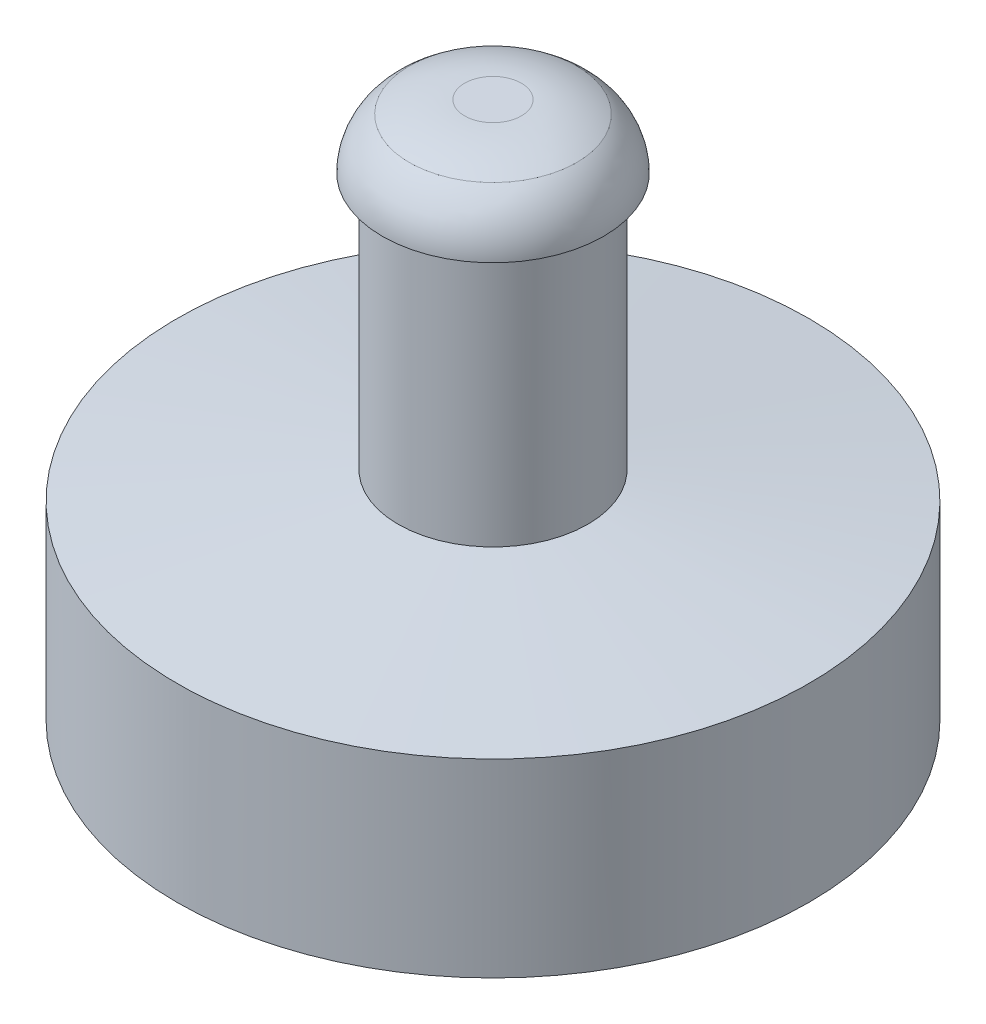
ISO-10303-21;
HEADER;
FILE_DESCRIPTION(('STEP AP214'),'2;1');
FILE_NAME('part.step','',(''),(''),'','','');
FILE_SCHEMA(('AUTOMOTIVE_DESIGN { 1 0 10303 214 1 1 1 1 }'));
ENDSEC;
DATA;
#1=APPLICATION_CONTEXT('core data for automotive mechanical design processes');
#2=APPLICATION_PROTOCOL_DEFINITION('international standard','automotive_design',2000,#1);
#3=PRODUCT_CONTEXT('',#1,'mechanical');
#4=PRODUCT('Part','Part','',(#3));
#5=PRODUCT_RELATED_PRODUCT_CATEGORY('part','',(#4));
#6=PRODUCT_DEFINITION_FORMATION('','',#4);
#7=PRODUCT_DEFINITION_CONTEXT('part definition',#1,'design');
#8=PRODUCT_DEFINITION('design','',#6,#7);
#9=PRODUCT_DEFINITION_SHAPE('','',#8);
#10=(LENGTH_UNIT() NAMED_UNIT(*) SI_UNIT(.MILLI.,.METRE.));
#11=(NAMED_UNIT(*) PLANE_ANGLE_UNIT() SI_UNIT($,.RADIAN.));
#12=(NAMED_UNIT(*) SI_UNIT($,.STERADIAN.) SOLID_ANGLE_UNIT());
#13=UNCERTAINTY_MEASURE_WITH_UNIT(LENGTH_MEASURE(1.E-05),#10,'distance_accuracy_value','');
#14=(GEOMETRIC_REPRESENTATION_CONTEXT(3) GLOBAL_UNCERTAINTY_ASSIGNED_CONTEXT((#13)) GLOBAL_UNIT_ASSIGNED_CONTEXT((#10,
#11,#12)) REPRESENTATION_CONTEXT('',''));
#15=CARTESIAN_POINT('',(0.,0.,0.));
#16=DIRECTION('',(0.,0.,1.));
#17=DIRECTION('',(1.,0.,0.));
#18=AXIS2_PLACEMENT_3D('',#15,#16,#17);
#19=CARTESIAN_POINT('',(0.,3.5,0.));
#20=DIRECTION('',(0.,-1.,0.));
#21=DIRECTION('',(0.,0.,-1.));
#22=AXIS2_PLACEMENT_3D('',#19,#20,#21);
#23=CYLINDRICAL_SURFACE('',#22,5.);
#24=CARTESIAN_POINT('',(0.,3.,0.));
#25=DIRECTION('',(0.,1.,0.));
#26=DIRECTION('',(0.,0.,1.));
#27=AXIS2_PLACEMENT_3D('',#24,#25,#26);
#28=CIRCLE('',#27,5.);
#29=CARTESIAN_POINT('',(0.,3.,-5.));
#30=VERTEX_POINT('',#29);
#31=EDGE_CURVE('E61',#30,#30,#28,.F.);
#32=ORIENTED_EDGE('',*,*,#31,.T.);
#33=EDGE_LOOP('',(#32));
#34=FACE_BOUND('',#33,.T.);
#35=CARTESIAN_POINT('',(0.,0.,0.));
#36=DIRECTION('',(0.,1.,0.));
#37=DIRECTION('',(0.,0.,1.));
#38=AXIS2_PLACEMENT_3D('',#35,#36,#37);
#39=CIRCLE('',#38,5.);
#40=CARTESIAN_POINT('',(0.,0.,5.));
#41=VERTEX_POINT('',#40);
#42=EDGE_CURVE('E67',#41,#41,#39,.T.);
#43=ORIENTED_EDGE('',*,*,#42,.T.);
#44=EDGE_LOOP('',(#43));
#45=FACE_BOUND('',#44,.T.);
#46=ADVANCED_FACE('F43',(#34,#45),#23,.T.);
#47=CARTESIAN_POINT('',(0.,0.,0.));
#48=DIRECTION('',(0.,1.,0.));
#49=DIRECTION('',(0.,0.,1.));
#50=AXIS2_PLACEMENT_3D('',#47,#48,#49);
#51=PLANE('',#50);
#52=ORIENTED_EDGE('',*,*,#42,.F.);
#53=EDGE_LOOP('',(#52));
#54=FACE_BOUND('',#53,.T.);
#55=ADVANCED_FACE('F96',(#54),#51,.F.);
#56=CARTESIAN_POINT('',(0.,3.5,0.));
#57=DIRECTION('',(0.,-1.,0.));
#58=DIRECTION('',(0.,0.,-1.));
#59=AXIS2_PLACEMENT_3D('',#56,#57,#58);
#60=CONICAL_SURFACE('',#59,0.927826786012709,1.44862327915529);
#61=CARTESIAN_POINT('',(0.,3.42974596316017,0.));
#62=DIRECTION('',(0.,-1.,0.));
#63=DIRECTION('',(0.,0.,-1.));
#64=AXIS2_PLACEMENT_3D('',#61,#62,#63);
#65=CIRCLE('',#64,1.5);
#66=CARTESIAN_POINT('',(0.,3.42974596316017,-1.5));
#67=VERTEX_POINT('',#66);
#68=EDGE_CURVE('E56',#67,#67,#65,.F.);
#69=CARTESIAN_POINT('',(0.,3.42974596316017,-1.5));
#70=CARTESIAN_POINT('',(0.,3.42526944271058,-1.53645833333333));
#71=CARTESIAN_POINT('',(0.,3.420792922261,-1.57291666666666));
#72=CARTESIAN_POINT('',(0.,3.41183988136183,-1.64583333333333));
#73=CARTESIAN_POINT('',(0.,3.40736336091224,-1.68229166666666));
#74=CARTESIAN_POINT('',(0.,3.39841032001307,-1.75520833333333));
#75=CARTESIAN_POINT('',(0.,3.39393379956349,-1.79166666666667));
#76=CARTESIAN_POINT('',(0.,3.38498075866432,-1.86458333333333));
#77=CARTESIAN_POINT('',(0.,3.38050423821473,-1.90104166666667));
#78=CARTESIAN_POINT('',(0.,3.37155119731556,-1.97395833333333));
#79=CARTESIAN_POINT('',(0.,3.36707467686598,-2.01041666666667));
#80=CARTESIAN_POINT('',(0.,3.35812163596681,-2.08333333333333));
#81=CARTESIAN_POINT('',(0.,3.35364511551722,-2.11979166666667));
#82=CARTESIAN_POINT('',(0.,3.34469207461805,-2.19270833333333));
#83=CARTESIAN_POINT('',(0.,3.34021555416847,-2.22916666666667));
#84=CARTESIAN_POINT('',(0.,3.3312625132693,-2.30208333333333));
#85=CARTESIAN_POINT('',(0.,3.32678599281971,-2.33854166666667));
#86=CARTESIAN_POINT('',(0.,3.31783295192054,-2.41145833333333));
#87=CARTESIAN_POINT('',(0.,3.31335643147095,-2.44791666666667));
#88=CARTESIAN_POINT('',(0.,3.30440339057178,-2.52083333333333));
#89=CARTESIAN_POINT('',(0.,3.2999268701222,-2.55729166666667));
#90=CARTESIAN_POINT('',(0.,3.29097382922303,-2.63020833333333));
#91=CARTESIAN_POINT('',(0.,3.28649730877344,-2.66666666666667));
#92=CARTESIAN_POINT('',(0.,3.27754426787427,-2.73958333333333));
#93=CARTESIAN_POINT('',(0.,3.27306774742469,-2.77604166666667));
#94=CARTESIAN_POINT('',(0.,3.26411470652552,-2.84895833333333));
#95=CARTESIAN_POINT('',(0.,3.25963818607593,-2.88541666666667));
#96=CARTESIAN_POINT('',(0.,3.25068514517676,-2.95833333333333));
#97=CARTESIAN_POINT('',(0.,3.24620862472718,-2.99479166666667));
#98=CARTESIAN_POINT('',(0.,3.23725558382801,-3.06770833333333));
#99=CARTESIAN_POINT('',(0.,3.23277906337842,-3.10416666666667));
#100=CARTESIAN_POINT('',(0.,3.22382602247925,-3.17708333333333));
#101=CARTESIAN_POINT('',(0.,3.21934950202967,-3.21354166666667));
#102=CARTESIAN_POINT('',(0.,3.2103964611305,-3.28645833333333));
#103=CARTESIAN_POINT('',(0.,3.20591994068091,-3.32291666666667));
#104=CARTESIAN_POINT('',(0.,3.19696689978174,-3.39583333333333));
#105=CARTESIAN_POINT('',(0.,3.19249037933216,-3.43229166666667));
#106=CARTESIAN_POINT('',(0.,3.18353733843299,-3.50520833333333));
#107=CARTESIAN_POINT('',(0.,3.1790608179834,-3.54166666666667));
#108=CARTESIAN_POINT('',(0.,3.17010777708423,-3.61458333333333));
#109=CARTESIAN_POINT('',(0.,3.16563125663465,-3.65104166666667));
#110=CARTESIAN_POINT('',(0.,3.15667821573548,-3.72395833333333));
#111=CARTESIAN_POINT('',(0.,3.15220169528589,-3.76041666666667));
#112=CARTESIAN_POINT('',(0.,3.14324865438672,-3.83333333333333));
#113=CARTESIAN_POINT('',(0.,3.13877213393714,-3.86979166666667));
#114=CARTESIAN_POINT('',(0.,3.12981909303797,-3.94270833333333));
#115=CARTESIAN_POINT('',(0.,3.12534257258838,-3.97916666666667));
#116=CARTESIAN_POINT('',(0.,3.11638953168921,-4.05208333333333));
#117=CARTESIAN_POINT('',(0.,3.11191301123963,-4.08854166666667));
#118=CARTESIAN_POINT('',(0.,3.10295997034046,-4.16145833333333));
#119=CARTESIAN_POINT('',(0.,3.09848344989087,-4.19791666666667));
#120=CARTESIAN_POINT('',(0.,3.0895304089917,-4.27083333333333));
#121=CARTESIAN_POINT('',(0.,3.08505388854212,-4.30729166666667));
#122=CARTESIAN_POINT('',(0.,3.07610084764295,-4.38020833333333));
#123=CARTESIAN_POINT('',(0.,3.07162432719336,-4.41666666666667));
#124=CARTESIAN_POINT('',(0.,3.06267128629419,-4.48958333333333));
#125=CARTESIAN_POINT('',(0.,3.05819476584461,-4.52604166666667));
#126=CARTESIAN_POINT('',(0.,3.04924172494544,-4.59895833333333));
#127=CARTESIAN_POINT('',(0.,3.04476520449585,-4.63541666666667));
#128=CARTESIAN_POINT('',(0.,3.03581216359668,-4.70833333333333));
#129=CARTESIAN_POINT('',(0.,3.0313356431471,-4.74479166666667));
#130=CARTESIAN_POINT('',(0.,3.02238260224792,-4.81770833333333));
#131=CARTESIAN_POINT('',(0.,3.01790608179834,-4.85416666666667));
#132=CARTESIAN_POINT('',(0.,3.00895304089917,-4.92708333333333));
#133=CARTESIAN_POINT('',(0.,3.00447652044958,-4.96354166666667));
#134=CARTESIAN_POINT('',(0.,3.,-5.));
#135=B_SPLINE_CURVE_WITH_KNOTS('',3,(#69,#70,#71,#72,#73,#74,#75,#76,#77,#78,#79,#80,#81,#82,
#83,#84,#85,#86,#87,#88,#89,#90,#91,#92,#93,#94,#95,#96,#97,#98,#99,#100,#101,#102,#103,#104,
#105,#106,#107,#108,#109,#110,#111,#112,#113,#114,#115,#116,#117,#118,#119,#120,#121,#122,#123,
#124,#125,#126,#127,#128,#129,#130,#131,#132,#133,#134),.UNSPECIFIED.,.F.,.F.,(4,2,2,2,2,2,2,2,
2,2,2,2,2,2,2,2,2,2,2,2,2,2,2,2,2,2,2,2,2,2,2,2,4),(0.,0.110196387159562,0.220392774319123,
0.330589161478685,0.440785548638246,0.550981935797808,0.66117832295737,0.771374710116931,
0.881571097276493,0.991767484436054,1.10196387159562,1.21216025875518,1.32235664591474,
1.4325530330743,1.54274942023386,1.65294580739342,1.76314219455299,1.87333858171255,
1.98353496887211,2.09373135603167,2.20392774319123,2.31412413035079,2.42432051751036,
2.53451690466992,2.64471329182948,2.75490967898904,2.8651060661486,2.97530245330816,
3.08549884046773,3.19569522762729,3.30589161478685,3.41608800194641,3.52628438910597),.UNSPECIFIED.);
#136=EDGE_CURVE('BSEAM102',#67,#30,#135,.T.);
#137=ORIENTED_EDGE('',*,*,#68,.F.);
#138=ORIENTED_EDGE('',*,*,#31,.F.);
#139=ORIENTED_EDGE('',*,*,#136,.T.);
#140=ORIENTED_EDGE('',*,*,#136,.F.);
#141=EDGE_LOOP('',(#137,#139,#138,#140));
#142=FACE_BOUND('',#141,.T.);
#143=ADVANCED_FACE('F102',(#142),#60,.T.);
#144=CARTESIAN_POINT('',(0.,2.5,0.));
#145=DIRECTION('',(0.,1.,0.));
#146=DIRECTION('',(0.,0.,1.));
#147=AXIS2_PLACEMENT_3D('',#144,#145,#146);
#148=CYLINDRICAL_SURFACE('',#147,1.5);
#149=ORIENTED_EDGE('',*,*,#68,.T.);
#150=EDGE_LOOP('',(#149));
#151=FACE_BOUND('',#150,.T.);
#152=CARTESIAN_POINT('',(0.,7.5,0.));
#153=DIRECTION('',(0.,1.,0.));
#154=DIRECTION('',(0.,0.,1.));
#155=AXIS2_PLACEMENT_3D('',#152,#153,#154);
#156=CIRCLE('',#155,1.5);
#157=CARTESIAN_POINT('',(0.,7.5,1.5));
#158=VERTEX_POINT('',#157);
#159=EDGE_CURVE('E71',#158,#158,#156,.T.);
#160=ORIENTED_EDGE('',*,*,#159,.F.);
#161=EDGE_LOOP('',(#160));
#162=FACE_BOUND('',#161,.T.);
#163=ADVANCED_FACE('F92',(#151,#162),#148,.T.);
#164=CARTESIAN_POINT('',(0.,8.5,0.));
#165=DIRECTION('',(0.,1.,0.));
#166=DIRECTION('',(0.,0.,1.));
#167=AXIS2_PLACEMENT_3D('',#164,#165,#166);
#168=PLANE('',#167);
#169=CARTESIAN_POINT('',(0.,8.5,0.));
#170=DIRECTION('',(0.,1.,0.));
#171=DIRECTION('',(0.,0.,1.));
#172=AXIS2_PLACEMENT_3D('',#169,#170,#171);
#173=CIRCLE('',#172,0.448786724614914);
#174=CARTESIAN_POINT('',(0.,8.5,0.448786724614914));
#175=VERTEX_POINT('',#174);
#176=EDGE_CURVE('E10',#175,#175,#173,.T.);
#177=ORIENTED_EDGE('',*,*,#176,.T.);
#178=EDGE_LOOP('',(#177));
#179=FACE_BOUND('',#178,.T.);
#180=ADVANCED_FACE('F84',(#179),#168,.T.);
#181=CARTESIAN_POINT('',(0.,7.5,0.));
#182=DIRECTION('',(0.,1.,0.));
#183=DIRECTION('',(0.,0.,1.));
#184=AXIS2_PLACEMENT_3D('',#181,#182,#183);
#185=PLANE('',#184);
#186=ORIENTED_EDGE('',*,*,#159,.T.);
#187=EDGE_LOOP('',(#186));
#188=FACE_BOUND('',#187,.T.);
#189=CARTESIAN_POINT('',(0.,7.5,0.));
#190=DIRECTION('',(0.,1.,0.));
#191=DIRECTION('',(0.,0.,1.));
#192=AXIS2_PLACEMENT_3D('',#189,#190,#191);
#193=CIRCLE('',#192,1.75);
#194=CARTESIAN_POINT('',(0.,7.5,1.75));
#195=VERTEX_POINT('',#194);
#196=EDGE_CURVE('E75',#195,#195,#193,.T.);
#197=ORIENTED_EDGE('',*,*,#196,.F.);
#198=EDGE_LOOP('',(#197));
#199=FACE_BOUND('',#198,.T.);
#200=ADVANCED_FACE('F82',(#188,#199),#185,.F.);
#201=CARTESIAN_POINT('',(0.,7.47928266600758,0.));
#202=DIRECTION('',(0.,-1.,0.));
#203=DIRECTION('',(0.,0.,-1.));
#204=AXIS2_PLACEMENT_3D('',#201,#202,#203);
#205=DEGENERATE_TOROIDAL_SURFACE('',#204,0.75021462699625,1.,.T.);
#206=CARTESIAN_POINT('',(0.,8.29843471029657,0.));
#207=DIRECTION('',(0.,-1.,0.));
#208=DIRECTION('',(0.,0.,-1.));
#209=AXIS2_PLACEMENT_3D('',#206,#207,#208);
#210=CIRCLE('',#209,1.3237910633473);
#211=CARTESIAN_POINT('',(0.,8.29843471029657,-1.3237910633473));
#212=VERTEX_POINT('',#211);
#213=EDGE_CURVE('E51',#212,#212,#210,.F.);
#214=ORIENTED_EDGE('',*,*,#213,.F.);
#215=EDGE_LOOP('',(#214));
#216=FACE_BOUND('',#215,.T.);
#217=ORIENTED_EDGE('',*,*,#196,.T.);
#218=EDGE_LOOP('',(#217));
#219=FACE_BOUND('',#218,.T.);
#220=ADVANCED_FACE('F80',(#216,#219),#205,.T.);
#221=CARTESIAN_POINT('',(0.,6.5,0.));
#222=DIRECTION('',(0.,-1.,0.));
#223=DIRECTION('',(0.,0.,-1.));
#224=AXIS2_PLACEMENT_3D('',#221,#222,#223);
#225=DEGENERATE_TOROIDAL_SURFACE('',#224,0.448786724614914,2.,.T.);
#226=ORIENTED_EDGE('',*,*,#213,.T.);
#227=EDGE_LOOP('',(#226));
#228=FACE_BOUND('',#227,.T.);
#229=ORIENTED_EDGE('',*,*,#176,.F.);
#230=EDGE_LOOP('',(#229));
#231=FACE_BOUND('',#230,.T.);
#232=ADVANCED_FACE('F45',(#228,#231),#225,.T.);
#233=CLOSED_SHELL('',(#46,#55,#143,#163,#180,#200,#220,#232));
#234=MANIFOLD_SOLID_BREP('B2',#233);
#235=ADVANCED_BREP_SHAPE_REPRESENTATION('',(#18,#234),#14);
#236=SHAPE_DEFINITION_REPRESENTATION(#9,#235);
ENDSEC;
END-ISO-10303-21;
